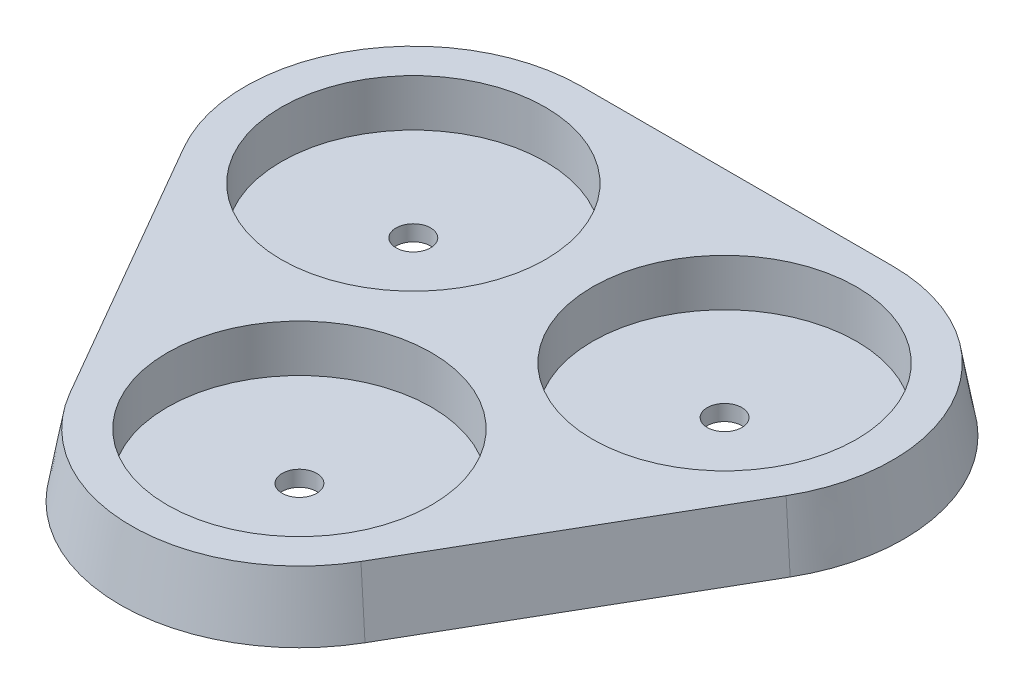
ISO-10303-21;
HEADER;
FILE_DESCRIPTION(('STEP AP214'),'2;1');
FILE_NAME('part.step','',(''),(''),'','','');
FILE_SCHEMA(('AUTOMOTIVE_DESIGN { 1 0 10303 214 1 1 1 1 }'));
ENDSEC;
DATA;
#1=APPLICATION_CONTEXT('core data for automotive mechanical design processes');
#2=APPLICATION_PROTOCOL_DEFINITION('international standard','automotive_design',2000,#1);
#3=PRODUCT_CONTEXT('',#1,'mechanical');
#4=PRODUCT('Part','Part','',(#3));
#5=PRODUCT_RELATED_PRODUCT_CATEGORY('part','',(#4));
#6=PRODUCT_DEFINITION_FORMATION('','',#4);
#7=PRODUCT_DEFINITION_CONTEXT('part definition',#1,'design');
#8=PRODUCT_DEFINITION('design','',#6,#7);
#9=PRODUCT_DEFINITION_SHAPE('','',#8);
#10=(LENGTH_UNIT() NAMED_UNIT(*) SI_UNIT(.MILLI.,.METRE.));
#11=(NAMED_UNIT(*) PLANE_ANGLE_UNIT() SI_UNIT($,.RADIAN.));
#12=(NAMED_UNIT(*) SI_UNIT($,.STERADIAN.) SOLID_ANGLE_UNIT());
#13=UNCERTAINTY_MEASURE_WITH_UNIT(LENGTH_MEASURE(1.E-05),#10,'distance_accuracy_value','');
#14=(GEOMETRIC_REPRESENTATION_CONTEXT(3) GLOBAL_UNCERTAINTY_ASSIGNED_CONTEXT((#13)) GLOBAL_UNIT_ASSIGNED_CONTEXT((#10,
#11,#12)) REPRESENTATION_CONTEXT('',''));
#15=CARTESIAN_POINT('',(0.,0.,0.));
#16=DIRECTION('',(0.,0.,1.));
#17=DIRECTION('',(1.,0.,0.));
#18=AXIS2_PLACEMENT_3D('',#15,#16,#17);
#19=CARTESIAN_POINT('',(-19.7999999999998,0.,0.));
#20=DIRECTION('',(0.,1.,0.));
#21=DIRECTION('',(0.,0.,1.));
#22=AXIS2_PLACEMENT_3D('',#19,#20,#21);
#23=CYLINDRICAL_SURFACE('',#22,1.10000000000001);
#24=CARTESIAN_POINT('',(-19.7999999999998,0.,0.));
#25=DIRECTION('',(0.,1.,0.));
#26=DIRECTION('',(0.,0.,1.));
#27=AXIS2_PLACEMENT_3D('',#24,#25,#26);
#28=CIRCLE('',#27,1.10000000000001);
#29=CARTESIAN_POINT('',(-19.7999999999998,0.,1.10000000000001));
#30=VERTEX_POINT('',#29);
#31=EDGE_CURVE('E135',#30,#30,#28,.T.);
#32=ORIENTED_EDGE('',*,*,#31,.F.);
#33=EDGE_LOOP('',(#32));
#34=FACE_BOUND('',#33,.T.);
#35=CARTESIAN_POINT('',(-19.7999999999998,1.,0.));
#36=DIRECTION('',(0.,1.,0.));
#37=DIRECTION('',(0.,0.,1.));
#38=AXIS2_PLACEMENT_3D('',#35,#36,#37);
#39=CIRCLE('',#38,1.10000000000001);
#40=CARTESIAN_POINT('',(-19.7999999999998,1.,1.10000000000001));
#41=VERTEX_POINT('',#40);
#42=EDGE_CURVE('E244',#41,#41,#39,.T.);
#43=ORIENTED_EDGE('',*,*,#42,.T.);
#44=EDGE_LOOP('',(#43));
#45=FACE_BOUND('',#44,.T.);
#46=ADVANCED_FACE('F54',(#34,#45),#23,.F.);
#47=CARTESIAN_POINT('',(0.,0.,0.));
#48=DIRECTION('',(0.,1.,0.));
#49=DIRECTION('',(0.,0.,1.));
#50=AXIS2_PLACEMENT_3D('',#47,#48,#49);
#51=CYLINDRICAL_SURFACE('',#50,1.1);
#52=CARTESIAN_POINT('',(0.,0.,0.));
#53=DIRECTION('',(0.,1.,0.));
#54=DIRECTION('',(0.,0.,1.));
#55=AXIS2_PLACEMENT_3D('',#52,#53,#54);
#56=CIRCLE('',#55,1.1);
#57=CARTESIAN_POINT('',(0.,0.,1.1));
#58=VERTEX_POINT('',#57);
#59=EDGE_CURVE('E132',#58,#58,#56,.T.);
#60=ORIENTED_EDGE('',*,*,#59,.F.);
#61=EDGE_LOOP('',(#60));
#62=FACE_BOUND('',#61,.T.);
#63=CARTESIAN_POINT('',(0.,1.,0.));
#64=DIRECTION('',(0.,1.,0.));
#65=DIRECTION('',(0.,0.,1.));
#66=AXIS2_PLACEMENT_3D('',#63,#64,#65);
#67=CIRCLE('',#66,1.1);
#68=CARTESIAN_POINT('',(0.,1.,1.1));
#69=VERTEX_POINT('',#68);
#70=EDGE_CURVE('E254',#69,#69,#67,.T.);
#71=ORIENTED_EDGE('',*,*,#70,.T.);
#72=EDGE_LOOP('',(#71));
#73=FACE_BOUND('',#72,.T.);
#74=ADVANCED_FACE('F182',(#62,#73),#51,.F.);
#75=CARTESIAN_POINT('',(-9.90000000000008,0.,17.1473029949318));
#76=DIRECTION('',(0.,1.,0.));
#77=DIRECTION('',(0.,0.,1.));
#78=AXIS2_PLACEMENT_3D('',#75,#76,#77);
#79=CYLINDRICAL_SURFACE('',#78,1.1);
#80=CARTESIAN_POINT('',(-9.90000000000008,0.,17.1473029949318));
#81=DIRECTION('',(0.,1.,0.));
#82=DIRECTION('',(0.,0.,1.));
#83=AXIS2_PLACEMENT_3D('',#80,#81,#82);
#84=CIRCLE('',#83,1.1);
#85=CARTESIAN_POINT('',(-9.90000000000008,0.,18.2473029949318));
#86=VERTEX_POINT('',#85);
#87=EDGE_CURVE('E129',#86,#86,#84,.T.);
#88=ORIENTED_EDGE('',*,*,#87,.F.);
#89=EDGE_LOOP('',(#88));
#90=FACE_BOUND('',#89,.T.);
#91=CARTESIAN_POINT('',(-9.90000000000008,1.,17.1473029949318));
#92=DIRECTION('',(0.,1.,0.));
#93=DIRECTION('',(0.,0.,1.));
#94=AXIS2_PLACEMENT_3D('',#91,#92,#93);
#95=CIRCLE('',#94,1.1);
#96=CARTESIAN_POINT('',(-9.90000000000008,1.,18.2473029949318));
#97=VERTEX_POINT('',#96);
#98=EDGE_CURVE('E240',#97,#97,#95,.T.);
#99=ORIENTED_EDGE('',*,*,#98,.T.);
#100=EDGE_LOOP('',(#99));
#101=FACE_BOUND('',#100,.T.);
#102=ADVANCED_FACE('F188',(#90,#101),#79,.F.);
#103=CARTESIAN_POINT('',(0.,0.,0.));
#104=DIRECTION('',(0.,-1.,0.));
#105=DIRECTION('',(0.,0.,1.));
#106=AXIS2_PLACEMENT_3D('',#103,#104,#105);
#107=CONICAL_SURFACE('',#106,11.4,0.174532925199433);
#108=CARTESIAN_POINT('',(0.,0.,0.));
#109=DIRECTION('',(0.,1.,0.));
#110=DIRECTION('',(0.,0.,1.));
#111=AXIS2_PLACEMENT_3D('',#108,#109,#110);
#112=CIRCLE('',#111,11.4);
#113=CARTESIAN_POINT('',(9.87268960314258,0.,5.70000000000005));
#114=VERTEX_POINT('',#113);
#115=CARTESIAN_POINT('',(0.,0.,-11.4));
#116=VERTEX_POINT('',#115);
#117=EDGE_CURVE('E116',#114,#116,#112,.T.);
#118=ORIENTED_EDGE('',*,*,#117,.T.);
#119=DIRECTION('',(0.,-0.984807753012208,-0.173648177666931));
#120=VECTOR('',#119,1.);
#121=CARTESIAN_POINT('',(0.,0.,-11.4));
#122=LINE('',#121,#120);
#123=CARTESIAN_POINT('',(0.,4.,-10.6946920771661));
#124=VERTEX_POINT('',#123);
#125=EDGE_CURVE('E12',#124,#116,#122,.T.);
#126=ORIENTED_EDGE('',*,*,#125,.F.);
#127=CARTESIAN_POINT('',(0.,4.,0.));
#128=DIRECTION('',(0.,1.,0.));
#129=DIRECTION('',(0.,0.,1.));
#130=AXIS2_PLACEMENT_3D('',#127,#128,#129);
#131=CIRCLE('',#130,10.6946920771661);
#132=CARTESIAN_POINT('',(9.26187502447802,4.,5.34734603858311));
#133=VERTEX_POINT('',#132);
#134=EDGE_CURVE('E145',#133,#124,#131,.T.);
#135=ORIENTED_EDGE('',*,*,#134,.F.);
#136=DIRECTION('',(0.150383733180435,-0.984807753012208,0.0868240888334661));
#137=VECTOR('',#136,1.);
#138=CARTESIAN_POINT('',(9.87268960314258,0.,5.70000000000004));
#139=LINE('',#138,#137);
#140=EDGE_CURVE('E71',#133,#114,#139,.T.);
#141=ORIENTED_EDGE('',*,*,#140,.T.);
#142=EDGE_LOOP('',(#118,#126,#135,#141));
#143=FACE_BOUND('',#142,.T.);
#144=ADVANCED_FACE('F128',(#143),#107,.T.);
#145=CARTESIAN_POINT('',(0.,0.,-11.4));
#146=DIRECTION('',(0.,0.173648177666931,-0.984807753012208));
#147=DIRECTION('',(0.,0.984807753012208,0.173648177666931));
#148=AXIS2_PLACEMENT_3D('',#145,#146,#147);
#149=PLANE('',#148);
#150=DIRECTION('',(-1.,0.,0.));
#151=VECTOR('',#150,1.);
#152=CARTESIAN_POINT('',(0.,0.,-11.4));
#153=LINE('',#152,#151);
#154=CARTESIAN_POINT('',(-19.7999999999998,0.,-11.4));
#155=VERTEX_POINT('',#154);
#156=EDGE_CURVE('E112',#116,#155,#153,.T.);
#157=ORIENTED_EDGE('',*,*,#156,.T.);
#158=DIRECTION('',(0.,-0.984807753012208,-0.173648177666931));
#159=VECTOR('',#158,1.);
#160=CARTESIAN_POINT('',(-19.7999999999998,0.,-11.4));
#161=LINE('',#160,#159);
#162=CARTESIAN_POINT('',(-19.7999999999998,4.,-10.6946920771661));
#163=VERTEX_POINT('',#162);
#164=EDGE_CURVE('E63',#163,#155,#161,.T.);
#165=ORIENTED_EDGE('',*,*,#164,.F.);
#166=DIRECTION('',(1.,0.,0.));
#167=VECTOR('',#166,1.);
#168=CARTESIAN_POINT('',(0.,4.,-10.6946920771661));
#169=LINE('',#168,#167);
#170=EDGE_CURVE('E125',#124,#163,#169,.F.);
#171=ORIENTED_EDGE('',*,*,#170,.F.);
#172=ORIENTED_EDGE('',*,*,#125,.T.);
#173=EDGE_LOOP('',(#157,#165,#171,#172));
#174=FACE_BOUND('',#173,.T.);
#175=ADVANCED_FACE('F56',(#174),#149,.T.);
#176=CARTESIAN_POINT('',(-19.7999999999998,0.,0.));
#177=DIRECTION('',(0.,-1.,0.));
#178=DIRECTION('',(0.,0.,1.));
#179=AXIS2_PLACEMENT_3D('',#176,#177,#178);
#180=CONICAL_SURFACE('',#179,11.4,0.174532925199433);
#181=CARTESIAN_POINT('',(-19.7999999999998,0.,0.));
#182=DIRECTION('',(0.,1.,0.));
#183=DIRECTION('',(0.,0.,1.));
#184=AXIS2_PLACEMENT_3D('',#181,#182,#183);
#185=CIRCLE('',#184,11.4);
#186=CARTESIAN_POINT('',(-29.6726896031425,0.,5.69999999999991));
#187=VERTEX_POINT('',#186);
#188=EDGE_CURVE('E119',#155,#187,#185,.T.);
#189=ORIENTED_EDGE('',*,*,#188,.T.);
#190=DIRECTION('',(-0.150383733180436,-0.984807753012208,0.086824088833464));
#191=VECTOR('',#190,1.);
#192=CARTESIAN_POINT('',(-29.6726896031425,0.,5.69999999999991));
#193=LINE('',#192,#191);
#194=CARTESIAN_POINT('',(-29.0618750244779,4.,5.34734603858298));
#195=VERTEX_POINT('',#194);
#196=EDGE_CURVE('E152',#195,#187,#193,.T.);
#197=ORIENTED_EDGE('',*,*,#196,.F.);
#198=CARTESIAN_POINT('',(-19.7999999999998,4.,0.));
#199=DIRECTION('',(0.,1.,0.));
#200=DIRECTION('',(0.,0.,1.));
#201=AXIS2_PLACEMENT_3D('',#198,#199,#200);
#202=CIRCLE('',#201,10.6946920771661);
#203=EDGE_CURVE('E157',#163,#195,#202,.T.);
#204=ORIENTED_EDGE('',*,*,#203,.F.);
#205=ORIENTED_EDGE('',*,*,#164,.T.);
#206=EDGE_LOOP('',(#189,#197,#204,#205));
#207=FACE_BOUND('',#206,.T.);
#208=ADVANCED_FACE('F166',(#207),#180,.T.);
#209=CARTESIAN_POINT('',(-24.7226896031427,0.,14.2736514974657));
#210=DIRECTION('',(-0.852868531952448,0.173648177666931,0.492403876506096));
#211=DIRECTION('',(0.499999999999992,0.,0.866025403784443));
#212=AXIS2_PLACEMENT_3D('',#209,#210,#211);
#213=PLANE('',#212);
#214=DIRECTION('',(-0.499999999999992,0.,-0.866025403784443));
#215=VECTOR('',#214,1.);
#216=CARTESIAN_POINT('',(-24.7226896031427,0.,14.2736514974657));
#217=LINE('',#216,#215);
#218=CARTESIAN_POINT('',(-19.7726896031427,0.,22.8473029949318));
#219=VERTEX_POINT('',#218);
#220=EDGE_CURVE('E139',#219,#187,#217,.T.);
#221=ORIENTED_EDGE('',*,*,#220,.F.);
#222=DIRECTION('',(-0.150383733180436,-0.984807753012208,0.086824088833464));
#223=VECTOR('',#222,1.);
#224=CARTESIAN_POINT('',(-19.7726896031427,0.,22.8473029949318));
#225=LINE('',#224,#223);
#226=CARTESIAN_POINT('',(-19.1618750244782,4.,22.4946490335148));
#227=VERTEX_POINT('',#226);
#228=EDGE_CURVE('E150',#227,#219,#225,.T.);
#229=ORIENTED_EDGE('',*,*,#228,.F.);
#230=DIRECTION('',(-0.499999999999992,0.,-0.866025403784443));
#231=VECTOR('',#230,1.);
#232=CARTESIAN_POINT('',(-24.1118750244781,4.,13.9209975360488));
#233=LINE('',#232,#231);
#234=EDGE_CURVE('E159',#227,#195,#233,.T.);
#235=ORIENTED_EDGE('',*,*,#234,.T.);
#236=ORIENTED_EDGE('',*,*,#196,.T.);
#237=EDGE_LOOP('',(#221,#229,#235,#236));
#238=FACE_BOUND('',#237,.T.);
#239=ADVANCED_FACE('F169',(#238),#213,.T.);
#240=CARTESIAN_POINT('',(-9.90000000000008,0.,17.1473029949318));
#241=DIRECTION('',(0.,-1.,0.));
#242=DIRECTION('',(0.,0.,1.));
#243=AXIS2_PLACEMENT_3D('',#240,#241,#242);
#244=CONICAL_SURFACE('',#243,11.4,0.174532925199433);
#245=CARTESIAN_POINT('',(-9.90000000000008,0.,17.1473029949318));
#246=DIRECTION('',(0.,1.,0.));
#247=DIRECTION('',(0.,0.,1.));
#248=AXIS2_PLACEMENT_3D('',#245,#246,#247);
#249=CIRCLE('',#248,11.4);
#250=CARTESIAN_POINT('',(-0.0273103968575052,0.,22.8473029949319));
#251=VERTEX_POINT('',#250);
#252=EDGE_CURVE('E141',#219,#251,#249,.T.);
#253=ORIENTED_EDGE('',*,*,#252,.T.);
#254=DIRECTION('',(0.150383733180435,-0.984807753012208,0.0868240888334661));
#255=VECTOR('',#254,1.);
#256=CARTESIAN_POINT('',(-0.0273103968575028,0.,22.8473029949319));
#257=LINE('',#256,#255);
#258=CARTESIAN_POINT('',(-0.63812497552206,4.,22.494649033515));
#259=VERTEX_POINT('',#258);
#260=EDGE_CURVE('E148',#259,#251,#257,.T.);
#261=ORIENTED_EDGE('',*,*,#260,.F.);
#262=CARTESIAN_POINT('',(-9.90000000000008,4.,17.1473029949318));
#263=DIRECTION('',(0.,1.,0.));
#264=DIRECTION('',(0.,0.,1.));
#265=AXIS2_PLACEMENT_3D('',#262,#263,#264);
#266=CIRCLE('',#265,10.6946920771661);
#267=EDGE_CURVE('E79',#227,#259,#266,.T.);
#268=ORIENTED_EDGE('',*,*,#267,.F.);
#269=ORIENTED_EDGE('',*,*,#228,.T.);
#270=EDGE_LOOP('',(#253,#261,#268,#269));
#271=FACE_BOUND('',#270,.T.);
#272=ADVANCED_FACE('F172',(#271),#244,.T.);
#273=CARTESIAN_POINT('',(9.87268960314258,0.,5.70000000000005));
#274=DIRECTION('',(0.852868531952441,0.173648177666931,0.492403876506108));
#275=DIRECTION('',(0.500000000000004,0.,-0.866025403784436));
#276=AXIS2_PLACEMENT_3D('',#273,#274,#275);
#277=PLANE('',#276);
#278=DIRECTION('',(-0.500000000000004,0.,0.866025403784436));
#279=VECTOR('',#278,1.);
#280=CARTESIAN_POINT('',(9.87268960314258,0.,5.70000000000005));
#281=LINE('',#280,#279);
#282=EDGE_CURVE('E144',#114,#251,#281,.T.);
#283=ORIENTED_EDGE('',*,*,#282,.F.);
#284=ORIENTED_EDGE('',*,*,#140,.F.);
#285=DIRECTION('',(-0.500000000000004,0.,0.866025403784436));
#286=VECTOR('',#285,1.);
#287=CARTESIAN_POINT('',(9.26187502447802,4.,5.34734603858311));
#288=LINE('',#287,#286);
#289=EDGE_CURVE('E58',#133,#259,#288,.T.);
#290=ORIENTED_EDGE('',*,*,#289,.T.);
#291=ORIENTED_EDGE('',*,*,#260,.T.);
#292=EDGE_LOOP('',(#283,#284,#290,#291));
#293=FACE_BOUND('',#292,.T.);
#294=ADVANCED_FACE('F161',(#293),#277,.T.);
#295=CARTESIAN_POINT('',(0.,4.,0.));
#296=DIRECTION('',(0.,1.,0.));
#297=DIRECTION('',(0.,0.,1.));
#298=AXIS2_PLACEMENT_3D('',#295,#296,#297);
#299=PLANE('',#298);
#300=CARTESIAN_POINT('',(0.,4.,0.));
#301=DIRECTION('',(0.,1.,0.));
#302=DIRECTION('',(0.,0.,1.));
#303=AXIS2_PLACEMENT_3D('',#300,#301,#302);
#304=CIRCLE('',#303,8.4);
#305=CARTESIAN_POINT('',(0.,4.,8.4));
#306=VERTEX_POINT('',#305);
#307=EDGE_CURVE('E257',#306,#306,#304,.T.);
#308=ORIENTED_EDGE('',*,*,#307,.F.);
#309=EDGE_LOOP('',(#308));
#310=FACE_BOUND('',#309,.T.);
#311=CARTESIAN_POINT('',(-9.90000000000008,4.,17.1473029949318));
#312=DIRECTION('',(0.,1.,0.));
#313=DIRECTION('',(0.,0.,1.));
#314=AXIS2_PLACEMENT_3D('',#311,#312,#313);
#315=CIRCLE('',#314,8.4);
#316=CARTESIAN_POINT('',(-9.90000000000008,4.,25.5473029949318));
#317=VERTEX_POINT('',#316);
#318=EDGE_CURVE('E245',#317,#317,#315,.T.);
#319=ORIENTED_EDGE('',*,*,#318,.F.);
#320=EDGE_LOOP('',(#319));
#321=FACE_BOUND('',#320,.T.);
#322=CARTESIAN_POINT('',(-19.7999999999998,4.,0.));
#323=DIRECTION('',(0.,1.,0.));
#324=DIRECTION('',(0.,0.,1.));
#325=AXIS2_PLACEMENT_3D('',#322,#323,#324);
#326=CIRCLE('',#325,8.40000000000001);
#327=CARTESIAN_POINT('',(-19.7999999999998,4.,8.40000000000001));
#328=VERTEX_POINT('',#327);
#329=EDGE_CURVE('E248',#328,#328,#326,.T.);
#330=ORIENTED_EDGE('',*,*,#329,.F.);
#331=EDGE_LOOP('',(#330));
#332=FACE_BOUND('',#331,.T.);
#333=ORIENTED_EDGE('',*,*,#134,.T.);
#334=ORIENTED_EDGE('',*,*,#170,.T.);
#335=ORIENTED_EDGE('',*,*,#203,.T.);
#336=ORIENTED_EDGE('',*,*,#234,.F.);
#337=ORIENTED_EDGE('',*,*,#267,.T.);
#338=ORIENTED_EDGE('',*,*,#289,.F.);
#339=EDGE_LOOP('',(#333,#334,#335,#336,#337,#338));
#340=FACE_BOUND('',#339,.T.);
#341=ADVANCED_FACE('F162',(#310,#321,#332,#340),#299,.T.);
#342=CARTESIAN_POINT('',(0.,0.,0.));
#343=DIRECTION('',(0.,1.,0.));
#344=DIRECTION('',(0.,0.,1.));
#345=AXIS2_PLACEMENT_3D('',#342,#343,#344);
#346=PLANE('',#345);
#347=ORIENTED_EDGE('',*,*,#87,.T.);
#348=EDGE_LOOP('',(#347));
#349=FACE_BOUND('',#348,.T.);
#350=ORIENTED_EDGE('',*,*,#59,.T.);
#351=EDGE_LOOP('',(#350));
#352=FACE_BOUND('',#351,.T.);
#353=ORIENTED_EDGE('',*,*,#31,.T.);
#354=EDGE_LOOP('',(#353));
#355=FACE_BOUND('',#354,.T.);
#356=ORIENTED_EDGE('',*,*,#117,.F.);
#357=ORIENTED_EDGE('',*,*,#282,.T.);
#358=ORIENTED_EDGE('',*,*,#252,.F.);
#359=ORIENTED_EDGE('',*,*,#220,.T.);
#360=ORIENTED_EDGE('',*,*,#188,.F.);
#361=ORIENTED_EDGE('',*,*,#156,.F.);
#362=EDGE_LOOP('',(#356,#357,#358,#359,#360,#361));
#363=FACE_BOUND('',#362,.T.);
#364=ADVANCED_FACE('F113',(#349,#352,#355,#363),#346,.F.);
#365=CARTESIAN_POINT('',(-9.90000000000008,1.,17.1473029949318));
#366=DIRECTION('',(0.,1.,0.));
#367=DIRECTION('',(0.,0.,1.));
#368=AXIS2_PLACEMENT_3D('',#365,#366,#367);
#369=CYLINDRICAL_SURFACE('',#368,8.4);
#370=CARTESIAN_POINT('',(-9.90000000000008,1.,17.1473029949318));
#371=DIRECTION('',(0.,1.,0.));
#372=DIRECTION('',(0.,0.,1.));
#373=AXIS2_PLACEMENT_3D('',#370,#371,#372);
#374=CIRCLE('',#373,8.4);
#375=CARTESIAN_POINT('',(-9.90000000000008,1.,25.5473029949318));
#376=VERTEX_POINT('',#375);
#377=EDGE_CURVE('E243',#376,#376,#374,.T.);
#378=ORIENTED_EDGE('',*,*,#377,.F.);
#379=EDGE_LOOP('',(#378));
#380=FACE_BOUND('',#379,.T.);
#381=ORIENTED_EDGE('',*,*,#318,.T.);
#382=EDGE_LOOP('',(#381));
#383=FACE_BOUND('',#382,.T.);
#384=ADVANCED_FACE('F200',(#380,#383),#369,.F.);
#385=CARTESIAN_POINT('',(-9.90000000000008,1.,17.1473029949318));
#386=DIRECTION('',(0.,1.,0.));
#387=DIRECTION('',(0.,0.,1.));
#388=AXIS2_PLACEMENT_3D('',#385,#386,#387);
#389=PLANE('',#388);
#390=ORIENTED_EDGE('',*,*,#98,.F.);
#391=EDGE_LOOP('',(#390));
#392=FACE_BOUND('',#391,.T.);
#393=ORIENTED_EDGE('',*,*,#377,.T.);
#394=EDGE_LOOP('',(#393));
#395=FACE_BOUND('',#394,.T.);
#396=ADVANCED_FACE('F225',(#392,#395),#389,.T.);
#397=CARTESIAN_POINT('',(0.,1.,0.));
#398=DIRECTION('',(0.,1.,0.));
#399=DIRECTION('',(0.,0.,1.));
#400=AXIS2_PLACEMENT_3D('',#397,#398,#399);
#401=CYLINDRICAL_SURFACE('',#400,8.4);
#402=CARTESIAN_POINT('',(0.,1.,0.));
#403=DIRECTION('',(0.,1.,0.));
#404=DIRECTION('',(0.,0.,1.));
#405=AXIS2_PLACEMENT_3D('',#402,#403,#404);
#406=CIRCLE('',#405,8.4);
#407=CARTESIAN_POINT('',(0.,1.,8.4));
#408=VERTEX_POINT('',#407);
#409=EDGE_CURVE('E258',#408,#408,#406,.T.);
#410=ORIENTED_EDGE('',*,*,#409,.F.);
#411=EDGE_LOOP('',(#410));
#412=FACE_BOUND('',#411,.T.);
#413=ORIENTED_EDGE('',*,*,#307,.T.);
#414=EDGE_LOOP('',(#413));
#415=FACE_BOUND('',#414,.T.);
#416=ADVANCED_FACE('F222',(#412,#415),#401,.F.);
#417=CARTESIAN_POINT('',(0.,1.,0.));
#418=DIRECTION('',(0.,1.,0.));
#419=DIRECTION('',(0.,0.,1.));
#420=AXIS2_PLACEMENT_3D('',#417,#418,#419);
#421=PLANE('',#420);
#422=ORIENTED_EDGE('',*,*,#70,.F.);
#423=EDGE_LOOP('',(#422));
#424=FACE_BOUND('',#423,.T.);
#425=ORIENTED_EDGE('',*,*,#409,.T.);
#426=EDGE_LOOP('',(#425));
#427=FACE_BOUND('',#426,.T.);
#428=ADVANCED_FACE('F217',(#424,#427),#421,.T.);
#429=CARTESIAN_POINT('',(-19.7999999999998,1.,0.));
#430=DIRECTION('',(0.,1.,0.));
#431=DIRECTION('',(0.,0.,1.));
#432=AXIS2_PLACEMENT_3D('',#429,#430,#431);
#433=CYLINDRICAL_SURFACE('',#432,8.40000000000001);
#434=CARTESIAN_POINT('',(-19.7999999999998,1.,0.));
#435=DIRECTION('',(0.,1.,0.));
#436=DIRECTION('',(0.,0.,1.));
#437=AXIS2_PLACEMENT_3D('',#434,#435,#436);
#438=CIRCLE('',#437,8.40000000000001);
#439=CARTESIAN_POINT('',(-19.7999999999998,1.,8.40000000000001));
#440=VERTEX_POINT('',#439);
#441=EDGE_CURVE('E263',#440,#440,#438,.T.);
#442=ORIENTED_EDGE('',*,*,#441,.F.);
#443=EDGE_LOOP('',(#442));
#444=FACE_BOUND('',#443,.T.);
#445=ORIENTED_EDGE('',*,*,#329,.T.);
#446=EDGE_LOOP('',(#445));
#447=FACE_BOUND('',#446,.T.);
#448=ADVANCED_FACE('F213',(#444,#447),#433,.F.);
#449=CARTESIAN_POINT('',(-19.7999999999998,1.,0.));
#450=DIRECTION('',(0.,1.,0.));
#451=DIRECTION('',(0.,0.,1.));
#452=AXIS2_PLACEMENT_3D('',#449,#450,#451);
#453=PLANE('',#452);
#454=ORIENTED_EDGE('',*,*,#42,.F.);
#455=EDGE_LOOP('',(#454));
#456=FACE_BOUND('',#455,.T.);
#457=ORIENTED_EDGE('',*,*,#441,.T.);
#458=EDGE_LOOP('',(#457));
#459=FACE_BOUND('',#458,.T.);
#460=ADVANCED_FACE('F216',(#456,#459),#453,.T.);
#461=CLOSED_SHELL('',(#46,#74,#102,#144,#175,#208,#239,#272,#294,#341,#364,#384,#396,#416,#428,
#448,#460));
#462=MANIFOLD_SOLID_BREP('B2',#461);
#463=ADVANCED_BREP_SHAPE_REPRESENTATION('',(#18,#462),#14);
#464=SHAPE_DEFINITION_REPRESENTATION(#9,#463);
ENDSEC;
END-ISO-10303-21;
